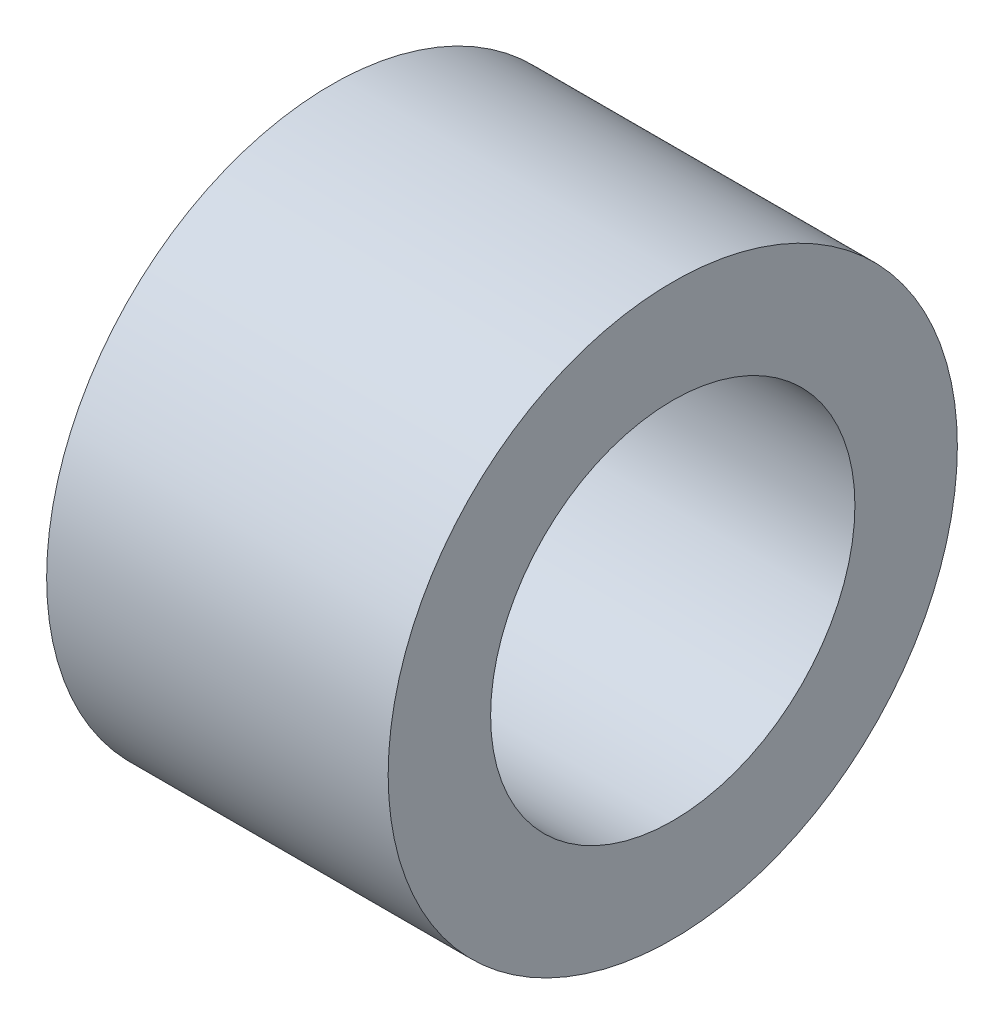
ISO-10303-21;
HEADER;
FILE_DESCRIPTION(('STEP AP214'),'2;1');
FILE_NAME('part.step','',(''),(''),'','','');
FILE_SCHEMA(('AUTOMOTIVE_DESIGN { 1 0 10303 214 1 1 1 1 }'));
ENDSEC;
DATA;
#1=APPLICATION_CONTEXT('core data for automotive mechanical design processes');
#2=APPLICATION_PROTOCOL_DEFINITION('international standard','automotive_design',2000,#1);
#3=PRODUCT_CONTEXT('',#1,'mechanical');
#4=PRODUCT('Part','Part','',(#3));
#5=PRODUCT_RELATED_PRODUCT_CATEGORY('part','',(#4));
#6=PRODUCT_DEFINITION_FORMATION('','',#4);
#7=PRODUCT_DEFINITION_CONTEXT('part definition',#1,'design');
#8=PRODUCT_DEFINITION('design','',#6,#7);
#9=PRODUCT_DEFINITION_SHAPE('','',#8);
#10=(LENGTH_UNIT() NAMED_UNIT(*) SI_UNIT(.MILLI.,.METRE.));
#11=(NAMED_UNIT(*) PLANE_ANGLE_UNIT() SI_UNIT($,.RADIAN.));
#12=(NAMED_UNIT(*) SI_UNIT($,.STERADIAN.) SOLID_ANGLE_UNIT());
#13=UNCERTAINTY_MEASURE_WITH_UNIT(LENGTH_MEASURE(1.E-05),#10,'distance_accuracy_value','');
#14=(GEOMETRIC_REPRESENTATION_CONTEXT(3) GLOBAL_UNCERTAINTY_ASSIGNED_CONTEXT((#13)) GLOBAL_UNIT_ASSIGNED_CONTEXT((#10,
#11,#12)) REPRESENTATION_CONTEXT('',''));
#15=CARTESIAN_POINT('',(0.,0.,0.));
#16=DIRECTION('',(0.,0.,1.));
#17=DIRECTION('',(1.,0.,0.));
#18=AXIS2_PLACEMENT_3D('',#15,#16,#17);
#19=CARTESIAN_POINT('',(0.,1.6,0.));
#20=DIRECTION('',(1.,0.,0.));
#21=DIRECTION('',(0.,0.,-1.));
#22=AXIS2_PLACEMENT_3D('',#19,#20,#21);
#23=PLANE('',#22);
#24=CARTESIAN_POINT('',(0.,0.,0.));
#25=DIRECTION('',(-1.,0.,0.));
#26=DIRECTION('',(0.,0.,1.));
#27=AXIS2_PLACEMENT_3D('',#24,#25,#26);
#28=CIRCLE('',#27,1.6);
#29=CARTESIAN_POINT('',(0.,0.,1.6));
#30=VERTEX_POINT('',#29);
#31=EDGE_CURVE('E52',#30,#30,#28,.T.);
#32=ORIENTED_EDGE('',*,*,#31,.F.);
#33=EDGE_LOOP('',(#32));
#34=FACE_BOUND('',#33,.T.);
#35=CARTESIAN_POINT('',(0.,0.,0.));
#36=DIRECTION('',(-1.,0.,0.));
#37=DIRECTION('',(0.,0.,1.));
#38=AXIS2_PLACEMENT_3D('',#35,#36,#37);
#39=CIRCLE('',#38,2.5);
#40=CARTESIAN_POINT('',(0.,0.,2.5));
#41=VERTEX_POINT('',#40);
#42=EDGE_CURVE('E10',#41,#41,#39,.T.);
#43=ORIENTED_EDGE('',*,*,#42,.T.);
#44=EDGE_LOOP('',(#43));
#45=FACE_BOUND('',#44,.T.);
#46=ADVANCED_FACE('F33',(#34,#45),#23,.F.);
#47=CARTESIAN_POINT('',(0.,0.,0.));
#48=DIRECTION('',(-1.,0.,0.));
#49=DIRECTION('',(0.,0.,1.));
#50=AXIS2_PLACEMENT_3D('',#47,#48,#49);
#51=CYLINDRICAL_SURFACE('',#50,2.5);
#52=ORIENTED_EDGE('',*,*,#42,.F.);
#53=EDGE_LOOP('',(#52));
#54=FACE_BOUND('',#53,.T.);
#55=CARTESIAN_POINT('',(3.,0.,0.));
#56=DIRECTION('',(-1.,0.,0.));
#57=DIRECTION('',(0.,0.,1.));
#58=AXIS2_PLACEMENT_3D('',#55,#56,#57);
#59=CIRCLE('',#58,2.5);
#60=CARTESIAN_POINT('',(3.,0.,2.5));
#61=VERTEX_POINT('',#60);
#62=EDGE_CURVE('E40',#61,#61,#59,.T.);
#63=ORIENTED_EDGE('',*,*,#62,.T.);
#64=EDGE_LOOP('',(#63));
#65=FACE_BOUND('',#64,.T.);
#66=ADVANCED_FACE('F63',(#54,#65),#51,.T.);
#67=CARTESIAN_POINT('',(3.,1.6,0.));
#68=DIRECTION('',(-1.,0.,0.));
#69=DIRECTION('',(0.,0.,1.));
#70=AXIS2_PLACEMENT_3D('',#67,#68,#69);
#71=PLANE('',#70);
#72=ORIENTED_EDGE('',*,*,#62,.F.);
#73=EDGE_LOOP('',(#72));
#74=FACE_BOUND('',#73,.T.);
#75=CARTESIAN_POINT('',(3.,0.,0.));
#76=DIRECTION('',(-1.,0.,0.));
#77=DIRECTION('',(0.,0.,1.));
#78=AXIS2_PLACEMENT_3D('',#75,#76,#77);
#79=CIRCLE('',#78,1.6);
#80=CARTESIAN_POINT('',(3.,0.,1.6));
#81=VERTEX_POINT('',#80);
#82=EDGE_CURVE('E46',#81,#81,#79,.T.);
#83=ORIENTED_EDGE('',*,*,#82,.T.);
#84=EDGE_LOOP('',(#83));
#85=FACE_BOUND('',#84,.T.);
#86=ADVANCED_FACE('F67',(#74,#85),#71,.F.);
#87=CARTESIAN_POINT('',(0.,0.,0.));
#88=DIRECTION('',(-1.,0.,0.));
#89=DIRECTION('',(0.,0.,1.));
#90=AXIS2_PLACEMENT_3D('',#87,#88,#89);
#91=CYLINDRICAL_SURFACE('',#90,1.6);
#92=ORIENTED_EDGE('',*,*,#82,.F.);
#93=EDGE_LOOP('',(#92));
#94=FACE_BOUND('',#93,.T.);
#95=ORIENTED_EDGE('',*,*,#31,.T.);
#96=EDGE_LOOP('',(#95));
#97=FACE_BOUND('',#96,.T.);
#98=ADVANCED_FACE('F60',(#94,#97),#91,.F.);
#99=CLOSED_SHELL('',(#46,#66,#86,#98));
#100=MANIFOLD_SOLID_BREP('B2',#99);
#101=ADVANCED_BREP_SHAPE_REPRESENTATION('',(#18,#100),#14);
#102=SHAPE_DEFINITION_REPRESENTATION(#9,#101);
ENDSEC;
END-ISO-10303-21;
